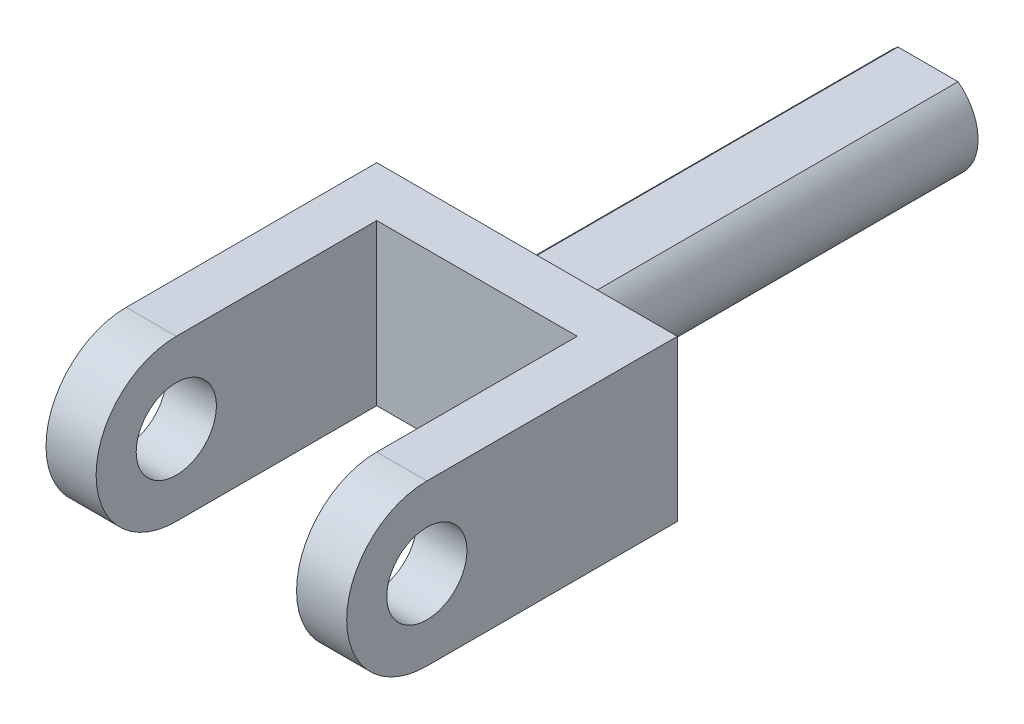
ISO-10303-21;
HEADER;
FILE_DESCRIPTION(('STEP AP214'),'2;1');
FILE_NAME('part.step','',(''),(''),'','','');
FILE_SCHEMA(('AUTOMOTIVE_DESIGN { 1 0 10303 214 1 1 1 1 }'));
ENDSEC;
DATA;
#1=APPLICATION_CONTEXT('core data for automotive mechanical design processes');
#2=APPLICATION_PROTOCOL_DEFINITION('international standard','automotive_design',2000,#1);
#3=PRODUCT_CONTEXT('',#1,'mechanical');
#4=PRODUCT('Part','Part','',(#3));
#5=PRODUCT_RELATED_PRODUCT_CATEGORY('part','',(#4));
#6=PRODUCT_DEFINITION_FORMATION('','',#4);
#7=PRODUCT_DEFINITION_CONTEXT('part definition',#1,'design');
#8=PRODUCT_DEFINITION('design','',#6,#7);
#9=PRODUCT_DEFINITION_SHAPE('','',#8);
#10=(LENGTH_UNIT() NAMED_UNIT(*) SI_UNIT(.MILLI.,.METRE.));
#11=(NAMED_UNIT(*) PLANE_ANGLE_UNIT() SI_UNIT($,.RADIAN.));
#12=(NAMED_UNIT(*) SI_UNIT($,.STERADIAN.) SOLID_ANGLE_UNIT());
#13=UNCERTAINTY_MEASURE_WITH_UNIT(LENGTH_MEASURE(1.E-05),#10,'distance_accuracy_value','');
#14=(GEOMETRIC_REPRESENTATION_CONTEXT(3) GLOBAL_UNCERTAINTY_ASSIGNED_CONTEXT((#13)) GLOBAL_UNIT_ASSIGNED_CONTEXT((#10,
#11,#12)) REPRESENTATION_CONTEXT('',''));
#15=CARTESIAN_POINT('',(0.,0.,0.));
#16=DIRECTION('',(0.,0.,1.));
#17=DIRECTION('',(1.,0.,0.));
#18=AXIS2_PLACEMENT_3D('',#15,#16,#17);
#19=CARTESIAN_POINT('',(15.,-8.,0.));
#20=DIRECTION('',(0.,0.,1.));
#21=DIRECTION('',(0.,-1.,0.));
#22=AXIS2_PLACEMENT_3D('',#19,#20,#21);
#23=PLANE('',#22);
#24=DIRECTION('',(0.,1.,0.));
#25=VECTOR('',#24,1.);
#26=CARTESIAN_POINT('',(-15.,-8.,0.));
#27=LINE('',#26,#25);
#28=CARTESIAN_POINT('',(-15.,-8.,0.));
#29=VERTEX_POINT('',#28);
#30=CARTESIAN_POINT('',(-15.,8.,0.));
#31=VERTEX_POINT('',#30);
#32=EDGE_CURVE('E199',#29,#31,#27,.T.);
#33=ORIENTED_EDGE('',*,*,#32,.T.);
#34=DIRECTION('',(-1.,0.,0.));
#35=VECTOR('',#34,1.);
#36=CARTESIAN_POINT('',(15.,8.,0.));
#37=LINE('',#36,#35);
#38=CARTESIAN_POINT('',(15.,8.,0.));
#39=VERTEX_POINT('',#38);
#40=EDGE_CURVE('E206',#39,#31,#37,.T.);
#41=ORIENTED_EDGE('',*,*,#40,.F.);
#42=DIRECTION('',(0.,1.,0.));
#43=VECTOR('',#42,1.);
#44=CARTESIAN_POINT('',(15.,-8.,0.));
#45=LINE('',#44,#43);
#46=CARTESIAN_POINT('',(15.,-8.,0.));
#47=VERTEX_POINT('',#46);
#48=EDGE_CURVE('E190',#47,#39,#45,.T.);
#49=ORIENTED_EDGE('',*,*,#48,.F.);
#50=DIRECTION('',(-1.,0.,0.));
#51=VECTOR('',#50,1.);
#52=CARTESIAN_POINT('',(15.,-8.,0.));
#53=LINE('',#52,#51);
#54=EDGE_CURVE('E209',#47,#29,#53,.T.);
#55=ORIENTED_EDGE('',*,*,#54,.T.);
#56=EDGE_LOOP('',(#33,#41,#49,#55));
#57=FACE_BOUND('',#56,.T.);
#58=CARTESIAN_POINT('',(0.,0.,0.));
#59=DIRECTION('',(0.,0.,-1.));
#60=DIRECTION('',(0.,1.,0.));
#61=AXIS2_PLACEMENT_3D('',#58,#59,#60);
#62=CIRCLE('',#61,5.);
#63=CARTESIAN_POINT('',(3.,4.,0.));
#64=VERTEX_POINT('',#63);
#65=CARTESIAN_POINT('',(3.,-4.,0.));
#66=VERTEX_POINT('',#65);
#67=EDGE_CURVE('E51',#64,#66,#62,.T.);
#68=ORIENTED_EDGE('',*,*,#67,.F.);
#69=DIRECTION('',(1.,0.,0.));
#70=VECTOR('',#69,1.);
#71=CARTESIAN_POINT('',(3.,4.,0.));
#72=LINE('',#71,#70);
#73=CARTESIAN_POINT('',(-3.,4.,0.));
#74=VERTEX_POINT('',#73);
#75=EDGE_CURVE('E55',#74,#64,#72,.T.);
#76=ORIENTED_EDGE('',*,*,#75,.F.);
#77=CARTESIAN_POINT('',(0.,0.,0.));
#78=DIRECTION('',(0.,0.,-1.));
#79=DIRECTION('',(0.,1.,0.));
#80=AXIS2_PLACEMENT_3D('',#77,#78,#79);
#81=CIRCLE('',#80,5.);
#82=CARTESIAN_POINT('',(-3.,-4.,0.));
#83=VERTEX_POINT('',#82);
#84=EDGE_CURVE('E399',#83,#74,#81,.T.);
#85=ORIENTED_EDGE('',*,*,#84,.F.);
#86=DIRECTION('',(-1.,0.,0.));
#87=VECTOR('',#86,1.);
#88=CARTESIAN_POINT('',(3.,-4.,0.));
#89=LINE('',#88,#87);
#90=EDGE_CURVE('E405',#66,#83,#89,.T.);
#91=ORIENTED_EDGE('',*,*,#90,.F.);
#92=EDGE_LOOP('',(#68,#76,#85,#91));
#93=FACE_BOUND('',#92,.T.);
#94=ADVANCED_FACE('F34',(#57,#93),#23,.F.);
#95=CARTESIAN_POINT('',(15.,0.,25.));
#96=DIRECTION('',(-1.,0.,0.));
#97=DIRECTION('',(0.,0.,1.));
#98=AXIS2_PLACEMENT_3D('',#95,#96,#97);
#99=CYLINDRICAL_SURFACE('',#98,8.);
#100=CARTESIAN_POINT('',(-10.,0.,25.));
#101=DIRECTION('',(-1.,0.,0.));
#102=DIRECTION('',(0.,0.,1.));
#103=AXIS2_PLACEMENT_3D('',#100,#101,#102);
#104=CIRCLE('',#103,8.);
#105=CARTESIAN_POINT('',(-10.,-8.,25.));
#106=VERTEX_POINT('',#105);
#107=CARTESIAN_POINT('',(-10.,8.,25.));
#108=VERTEX_POINT('',#107);
#109=EDGE_CURVE('E175',#106,#108,#104,.T.);
#110=ORIENTED_EDGE('',*,*,#109,.T.);
#111=DIRECTION('',(-1.,0.,0.));
#112=VECTOR('',#111,1.);
#113=CARTESIAN_POINT('',(15.,7.99999999999999,25.));
#114=LINE('',#113,#112);
#115=CARTESIAN_POINT('',(-15.,7.99999999999999,25.));
#116=VERTEX_POINT('',#115);
#117=EDGE_CURVE('E194',#108,#116,#114,.T.);
#118=ORIENTED_EDGE('',*,*,#117,.T.);
#119=CARTESIAN_POINT('',(-15.,0.,25.));
#120=DIRECTION('',(1.,0.,0.));
#121=DIRECTION('',(0.,0.,-1.));
#122=AXIS2_PLACEMENT_3D('',#119,#120,#121);
#123=CIRCLE('',#122,8.);
#124=CARTESIAN_POINT('',(-15.,-8.,25.));
#125=VERTEX_POINT('',#124);
#126=EDGE_CURVE('E181',#116,#125,#123,.T.);
#127=ORIENTED_EDGE('',*,*,#126,.T.);
#128=DIRECTION('',(-1.,0.,0.));
#129=VECTOR('',#128,1.);
#130=CARTESIAN_POINT('',(15.,-8.,25.));
#131=LINE('',#130,#129);
#132=EDGE_CURVE('E43',#106,#125,#131,.T.);
#133=ORIENTED_EDGE('',*,*,#132,.F.);
#134=EDGE_LOOP('',(#110,#118,#127,#133));
#135=FACE_BOUND('',#134,.T.);
#136=ADVANCED_FACE('F237',(#135),#99,.T.);
#137=CARTESIAN_POINT('',(15.,0.,25.));
#138=DIRECTION('',(-1.,0.,0.));
#139=DIRECTION('',(0.,0.,1.));
#140=AXIS2_PLACEMENT_3D('',#137,#138,#139);
#141=CYLINDRICAL_SURFACE('',#140,4.);
#142=CARTESIAN_POINT('',(-10.,0.,25.));
#143=DIRECTION('',(-1.,0.,0.));
#144=DIRECTION('',(0.,0.,1.));
#145=AXIS2_PLACEMENT_3D('',#142,#143,#144);
#146=CIRCLE('',#145,4.);
#147=CARTESIAN_POINT('',(-10.,0.,29.));
#148=VERTEX_POINT('',#147);
#149=EDGE_CURVE('E38',#148,#148,#146,.T.);
#150=ORIENTED_EDGE('',*,*,#149,.F.);
#151=EDGE_LOOP('',(#150));
#152=FACE_BOUND('',#151,.T.);
#153=CARTESIAN_POINT('',(-15.,0.,25.));
#154=DIRECTION('',(1.,0.,0.));
#155=DIRECTION('',(0.,0.,-1.));
#156=AXIS2_PLACEMENT_3D('',#153,#154,#155);
#157=CIRCLE('',#156,4.);
#158=CARTESIAN_POINT('',(-15.,0.,21.));
#159=VERTEX_POINT('',#158);
#160=EDGE_CURVE('E177',#159,#159,#157,.T.);
#161=ORIENTED_EDGE('',*,*,#160,.F.);
#162=EDGE_LOOP('',(#161));
#163=FACE_BOUND('',#162,.T.);
#164=ADVANCED_FACE('F223',(#152,#163),#141,.F.);
#165=CARTESIAN_POINT('',(15.,0.,25.));
#166=DIRECTION('',(1.,0.,0.));
#167=DIRECTION('',(0.,0.,-1.));
#168=AXIS2_PLACEMENT_3D('',#165,#166,#167);
#169=PLANE('',#168);
#170=CARTESIAN_POINT('',(15.,0.,25.));
#171=DIRECTION('',(1.,0.,0.));
#172=DIRECTION('',(0.,0.,-1.));
#173=AXIS2_PLACEMENT_3D('',#170,#171,#172);
#174=CIRCLE('',#173,8.);
#175=CARTESIAN_POINT('',(15.,7.99999999999999,25.));
#176=VERTEX_POINT('',#175);
#177=CARTESIAN_POINT('',(15.,-8.,25.));
#178=VERTEX_POINT('',#177);
#179=EDGE_CURVE('E184',#176,#178,#174,.T.);
#180=ORIENTED_EDGE('',*,*,#179,.T.);
#181=DIRECTION('',(0.,0.,-1.));
#182=VECTOR('',#181,1.);
#183=CARTESIAN_POINT('',(15.,-8.,25.));
#184=LINE('',#183,#182);
#185=EDGE_CURVE('E187',#178,#47,#184,.T.);
#186=ORIENTED_EDGE('',*,*,#185,.T.);
#187=ORIENTED_EDGE('',*,*,#48,.T.);
#188=DIRECTION('',(0.,0.,1.));
#189=VECTOR('',#188,1.);
#190=CARTESIAN_POINT('',(15.,7.99999999999999,25.));
#191=LINE('',#190,#189);
#192=EDGE_CURVE('E192',#39,#176,#191,.T.);
#193=ORIENTED_EDGE('',*,*,#192,.T.);
#194=EDGE_LOOP('',(#180,#186,#187,#193));
#195=FACE_BOUND('',#194,.T.);
#196=CARTESIAN_POINT('',(15.,0.,25.));
#197=DIRECTION('',(1.,0.,0.));
#198=DIRECTION('',(0.,0.,-1.));
#199=AXIS2_PLACEMENT_3D('',#196,#197,#198);
#200=CIRCLE('',#199,4.);
#201=CARTESIAN_POINT('',(15.,0.,21.));
#202=VERTEX_POINT('',#201);
#203=EDGE_CURVE('E178',#202,#202,#200,.T.);
#204=ORIENTED_EDGE('',*,*,#203,.F.);
#205=EDGE_LOOP('',(#204));
#206=FACE_BOUND('',#205,.T.);
#207=ADVANCED_FACE('F226',(#195,#206),#169,.T.);
#208=CARTESIAN_POINT('',(-15.,0.,25.));
#209=DIRECTION('',(1.,0.,0.));
#210=DIRECTION('',(0.,0.,-1.));
#211=AXIS2_PLACEMENT_3D('',#208,#209,#210);
#212=PLANE('',#211);
#213=ORIENTED_EDGE('',*,*,#126,.F.);
#214=DIRECTION('',(0.,0.,1.));
#215=VECTOR('',#214,1.);
#216=CARTESIAN_POINT('',(-15.,7.99999999999999,25.));
#217=LINE('',#216,#215);
#218=EDGE_CURVE('E188',#31,#116,#217,.T.);
#219=ORIENTED_EDGE('',*,*,#218,.F.);
#220=ORIENTED_EDGE('',*,*,#32,.F.);
#221=DIRECTION('',(0.,0.,-1.));
#222=VECTOR('',#221,1.);
#223=CARTESIAN_POINT('',(-15.,-8.,25.));
#224=LINE('',#223,#222);
#225=EDGE_CURVE('E197',#125,#29,#224,.T.);
#226=ORIENTED_EDGE('',*,*,#225,.F.);
#227=EDGE_LOOP('',(#213,#219,#220,#226));
#228=FACE_BOUND('',#227,.T.);
#229=ORIENTED_EDGE('',*,*,#160,.T.);
#230=EDGE_LOOP('',(#229));
#231=FACE_BOUND('',#230,.T.);
#232=ADVANCED_FACE('F228',(#228,#231),#212,.F.);
#233=CARTESIAN_POINT('',(10.,7.99999999999999,25.));
#234=VERTEX_POINT('',#233);
#235=EDGE_CURVE('E203',#176,#234,#114,.T.);
#236=ORIENTED_EDGE('',*,*,#235,.T.);
#237=CARTESIAN_POINT('',(10.,0.,25.));
#238=DIRECTION('',(1.,0.,0.));
#239=DIRECTION('',(0.,0.,-1.));
#240=AXIS2_PLACEMENT_3D('',#237,#238,#239);
#241=CIRCLE('',#240,8.);
#242=CARTESIAN_POINT('',(10.,-8.,25.));
#243=VERTEX_POINT('',#242);
#244=EDGE_CURVE('E173',#234,#243,#241,.T.);
#245=ORIENTED_EDGE('',*,*,#244,.T.);
#246=EDGE_CURVE('E11',#178,#243,#131,.T.);
#247=ORIENTED_EDGE('',*,*,#246,.F.);
#248=ORIENTED_EDGE('',*,*,#179,.F.);
#249=EDGE_LOOP('',(#236,#245,#247,#248));
#250=FACE_BOUND('',#249,.T.);
#251=ADVANCED_FACE('F36',(#250),#99,.T.);
#252=CARTESIAN_POINT('',(15.,-8.,25.));
#253=DIRECTION('',(0.,1.,0.));
#254=DIRECTION('',(0.,0.,1.));
#255=AXIS2_PLACEMENT_3D('',#252,#253,#254);
#256=PLANE('',#255);
#257=DIRECTION('',(-1.,0.,0.));
#258=VECTOR('',#257,1.);
#259=CARTESIAN_POINT('',(-10.,-8.,5.));
#260=LINE('',#259,#258);
#261=CARTESIAN_POINT('',(10.,-8.,5.));
#262=VERTEX_POINT('',#261);
#263=CARTESIAN_POINT('',(-10.,-8.,5.));
#264=VERTEX_POINT('',#263);
#265=EDGE_CURVE('E164',#262,#264,#260,.T.);
#266=ORIENTED_EDGE('',*,*,#265,.T.);
#267=DIRECTION('',(0.,0.,1.));
#268=VECTOR('',#267,1.);
#269=CARTESIAN_POINT('',(-10.,-8.,33.));
#270=LINE('',#269,#268);
#271=EDGE_CURVE('E158',#264,#106,#270,.T.);
#272=ORIENTED_EDGE('',*,*,#271,.T.);
#273=ORIENTED_EDGE('',*,*,#132,.T.);
#274=ORIENTED_EDGE('',*,*,#225,.T.);
#275=ORIENTED_EDGE('',*,*,#54,.F.);
#276=ORIENTED_EDGE('',*,*,#185,.F.);
#277=ORIENTED_EDGE('',*,*,#246,.T.);
#278=DIRECTION('',(0.,0.,-1.));
#279=VECTOR('',#278,1.);
#280=CARTESIAN_POINT('',(10.,-8.,33.));
#281=LINE('',#280,#279);
#282=EDGE_CURVE('E161',#243,#262,#281,.T.);
#283=ORIENTED_EDGE('',*,*,#282,.T.);
#284=EDGE_LOOP('',(#266,#272,#273,#274,#275,#276,#277,#283));
#285=FACE_BOUND('',#284,.T.);
#286=ADVANCED_FACE('F247',(#285),#256,.F.);
#287=CARTESIAN_POINT('',(15.,7.99999999999999,25.));
#288=DIRECTION('',(0.,-1.,0.));
#289=DIRECTION('',(0.,0.,-1.));
#290=AXIS2_PLACEMENT_3D('',#287,#288,#289);
#291=PLANE('',#290);
#292=ORIENTED_EDGE('',*,*,#117,.F.);
#293=DIRECTION('',(0.,0.,1.));
#294=VECTOR('',#293,1.);
#295=CARTESIAN_POINT('',(-10.,8.,33.));
#296=LINE('',#295,#294);
#297=CARTESIAN_POINT('',(-10.,8.,5.));
#298=VERTEX_POINT('',#297);
#299=EDGE_CURVE('E145',#298,#108,#296,.T.);
#300=ORIENTED_EDGE('',*,*,#299,.F.);
#301=DIRECTION('',(-1.,0.,0.));
#302=VECTOR('',#301,1.);
#303=CARTESIAN_POINT('',(-10.,8.,5.));
#304=LINE('',#303,#302);
#305=CARTESIAN_POINT('',(10.,8.,5.));
#306=VERTEX_POINT('',#305);
#307=EDGE_CURVE('E155',#306,#298,#304,.T.);
#308=ORIENTED_EDGE('',*,*,#307,.F.);
#309=DIRECTION('',(0.,0.,-1.));
#310=VECTOR('',#309,1.);
#311=CARTESIAN_POINT('',(10.,8.,33.));
#312=LINE('',#311,#310);
#313=EDGE_CURVE('E148',#234,#306,#312,.T.);
#314=ORIENTED_EDGE('',*,*,#313,.F.);
#315=ORIENTED_EDGE('',*,*,#235,.F.);
#316=ORIENTED_EDGE('',*,*,#192,.F.);
#317=ORIENTED_EDGE('',*,*,#40,.T.);
#318=ORIENTED_EDGE('',*,*,#218,.T.);
#319=EDGE_LOOP('',(#292,#300,#308,#314,#315,#316,#317,#318));
#320=FACE_BOUND('',#319,.T.);
#321=ADVANCED_FACE('F221',(#320),#291,.F.);
#322=CARTESIAN_POINT('',(10.,0.,25.));
#323=DIRECTION('',(1.,0.,0.));
#324=DIRECTION('',(0.,0.,-1.));
#325=AXIS2_PLACEMENT_3D('',#322,#323,#324);
#326=CIRCLE('',#325,4.);
#327=CARTESIAN_POINT('',(10.,0.,21.));
#328=VERTEX_POINT('',#327);
#329=EDGE_CURVE('E170',#328,#328,#326,.T.);
#330=ORIENTED_EDGE('',*,*,#329,.F.);
#331=EDGE_LOOP('',(#330));
#332=FACE_BOUND('',#331,.T.);
#333=ORIENTED_EDGE('',*,*,#203,.T.);
#334=EDGE_LOOP('',(#333));
#335=FACE_BOUND('',#334,.T.);
#336=ADVANCED_FACE('F217',(#332,#335),#141,.F.);
#337=CARTESIAN_POINT('',(-10.,-8.,33.));
#338=DIRECTION('',(-1.,0.,0.));
#339=DIRECTION('',(0.,0.,1.));
#340=AXIS2_PLACEMENT_3D('',#337,#338,#339);
#341=PLANE('',#340);
#342=ORIENTED_EDGE('',*,*,#149,.T.);
#343=EDGE_LOOP('',(#342));
#344=FACE_BOUND('',#343,.T.);
#345=ORIENTED_EDGE('',*,*,#109,.F.);
#346=ORIENTED_EDGE('',*,*,#271,.F.);
#347=DIRECTION('',(0.,1.,0.));
#348=VECTOR('',#347,1.);
#349=CARTESIAN_POINT('',(-10.,-8.,5.));
#350=LINE('',#349,#348);
#351=EDGE_CURVE('E168',#264,#298,#350,.T.);
#352=ORIENTED_EDGE('',*,*,#351,.T.);
#353=ORIENTED_EDGE('',*,*,#299,.T.);
#354=EDGE_LOOP('',(#345,#346,#352,#353));
#355=FACE_BOUND('',#354,.T.);
#356=ADVANCED_FACE('F220',(#344,#355),#341,.F.);
#357=CARTESIAN_POINT('',(10.,-8.,33.));
#358=DIRECTION('',(1.,0.,0.));
#359=DIRECTION('',(0.,0.,-1.));
#360=AXIS2_PLACEMENT_3D('',#357,#358,#359);
#361=PLANE('',#360);
#362=ORIENTED_EDGE('',*,*,#329,.T.);
#363=EDGE_LOOP('',(#362));
#364=FACE_BOUND('',#363,.T.);
#365=ORIENTED_EDGE('',*,*,#313,.T.);
#366=DIRECTION('',(0.,1.,0.));
#367=VECTOR('',#366,1.);
#368=CARTESIAN_POINT('',(10.,-8.,5.));
#369=LINE('',#368,#367);
#370=EDGE_CURVE('E167',#262,#306,#369,.T.);
#371=ORIENTED_EDGE('',*,*,#370,.F.);
#372=ORIENTED_EDGE('',*,*,#282,.F.);
#373=ORIENTED_EDGE('',*,*,#244,.F.);
#374=EDGE_LOOP('',(#365,#371,#372,#373));
#375=FACE_BOUND('',#374,.T.);
#376=ADVANCED_FACE('F214',(#364,#375),#361,.F.);
#377=CARTESIAN_POINT('',(-10.,-8.,5.));
#378=DIRECTION('',(0.,0.,-1.));
#379=DIRECTION('',(-1.,0.,0.));
#380=AXIS2_PLACEMENT_3D('',#377,#378,#379);
#381=PLANE('',#380);
#382=ORIENTED_EDGE('',*,*,#351,.F.);
#383=ORIENTED_EDGE('',*,*,#265,.F.);
#384=ORIENTED_EDGE('',*,*,#370,.T.);
#385=ORIENTED_EDGE('',*,*,#307,.T.);
#386=EDGE_LOOP('',(#382,#383,#384,#385));
#387=FACE_BOUND('',#386,.T.);
#388=ADVANCED_FACE('F261',(#387),#381,.F.);
#389=CARTESIAN_POINT('',(0.,0.,-40.));
#390=DIRECTION('',(0.,0.,1.));
#391=DIRECTION('',(0.,-1.,0.));
#392=AXIS2_PLACEMENT_3D('',#389,#390,#391);
#393=CYLINDRICAL_SURFACE('',#392,5.);
#394=ORIENTED_EDGE('',*,*,#67,.T.);
#395=DIRECTION('',(0.,0.,1.));
#396=VECTOR('',#395,1.);
#397=CARTESIAN_POINT('',(3.,-3.99999999999999,-40.));
#398=LINE('',#397,#396);
#399=CARTESIAN_POINT('',(3.,-3.99999999999999,-40.));
#400=VERTEX_POINT('',#399);
#401=EDGE_CURVE('E128',#400,#66,#398,.T.);
#402=ORIENTED_EDGE('',*,*,#401,.F.);
#403=CARTESIAN_POINT('',(0.,0.,-40.));
#404=DIRECTION('',(0.,0.,-1.));
#405=DIRECTION('',(0.,1.,0.));
#406=AXIS2_PLACEMENT_3D('',#403,#404,#405);
#407=CIRCLE('',#406,5.);
#408=CARTESIAN_POINT('',(3.,4.00000000000001,-40.));
#409=VERTEX_POINT('',#408);
#410=EDGE_CURVE('E134',#409,#400,#407,.T.);
#411=ORIENTED_EDGE('',*,*,#410,.F.);
#412=DIRECTION('',(0.,0.,1.));
#413=VECTOR('',#412,1.);
#414=CARTESIAN_POINT('',(3.,4.00000000000001,-40.));
#415=LINE('',#414,#413);
#416=EDGE_CURVE('E397',#409,#64,#415,.T.);
#417=ORIENTED_EDGE('',*,*,#416,.T.);
#418=EDGE_LOOP('',(#394,#402,#411,#417));
#419=FACE_BOUND('',#418,.T.);
#420=ADVANCED_FACE('F144',(#419),#393,.T.);
#421=CARTESIAN_POINT('',(3.,-3.99999999999999,-40.));
#422=DIRECTION('',(0.,1.,0.));
#423=DIRECTION('',(0.,0.,1.));
#424=AXIS2_PLACEMENT_3D('',#421,#422,#423);
#425=PLANE('',#424);
#426=ORIENTED_EDGE('',*,*,#90,.T.);
#427=DIRECTION('',(0.,0.,1.));
#428=VECTOR('',#427,1.);
#429=CARTESIAN_POINT('',(-3.,-3.99999999999999,-40.));
#430=LINE('',#429,#428);
#431=CARTESIAN_POINT('',(-3.,-3.99999999999999,-40.));
#432=VERTEX_POINT('',#431);
#433=EDGE_CURVE('E130',#432,#83,#430,.T.);
#434=ORIENTED_EDGE('',*,*,#433,.F.);
#435=DIRECTION('',(-1.,0.,0.));
#436=VECTOR('',#435,1.);
#437=CARTESIAN_POINT('',(3.,-3.99999999999999,-40.));
#438=LINE('',#437,#436);
#439=EDGE_CURVE('E123',#400,#432,#438,.T.);
#440=ORIENTED_EDGE('',*,*,#439,.F.);
#441=ORIENTED_EDGE('',*,*,#401,.T.);
#442=EDGE_LOOP('',(#426,#434,#440,#441));
#443=FACE_BOUND('',#442,.T.);
#444=ADVANCED_FACE('F126',(#443),#425,.F.);
#445=CARTESIAN_POINT('',(0.,0.,-40.));
#446=DIRECTION('',(0.,0.,1.));
#447=DIRECTION('',(0.,-1.,0.));
#448=AXIS2_PLACEMENT_3D('',#445,#446,#447);
#449=CYLINDRICAL_SURFACE('',#448,5.);
#450=ORIENTED_EDGE('',*,*,#84,.T.);
#451=DIRECTION('',(0.,0.,1.));
#452=VECTOR('',#451,1.);
#453=CARTESIAN_POINT('',(-3.,4.00000000000001,-40.));
#454=LINE('',#453,#452);
#455=CARTESIAN_POINT('',(-3.,4.00000000000001,-40.));
#456=VERTEX_POINT('',#455);
#457=EDGE_CURVE('E150',#456,#74,#454,.T.);
#458=ORIENTED_EDGE('',*,*,#457,.F.);
#459=CARTESIAN_POINT('',(0.,0.,-40.));
#460=DIRECTION('',(0.,0.,-1.));
#461=DIRECTION('',(0.,1.,0.));
#462=AXIS2_PLACEMENT_3D('',#459,#460,#461);
#463=CIRCLE('',#462,5.);
#464=EDGE_CURVE('E133',#432,#456,#463,.T.);
#465=ORIENTED_EDGE('',*,*,#464,.F.);
#466=ORIENTED_EDGE('',*,*,#433,.T.);
#467=EDGE_LOOP('',(#450,#458,#465,#466));
#468=FACE_BOUND('',#467,.T.);
#469=ADVANCED_FACE('F293',(#468),#449,.T.);
#470=CARTESIAN_POINT('',(3.,4.00000000000001,-40.));
#471=DIRECTION('',(0.,-1.,0.));
#472=DIRECTION('',(0.,0.,-1.));
#473=AXIS2_PLACEMENT_3D('',#470,#471,#472);
#474=PLANE('',#473);
#475=ORIENTED_EDGE('',*,*,#75,.T.);
#476=ORIENTED_EDGE('',*,*,#416,.F.);
#477=DIRECTION('',(1.,0.,0.));
#478=VECTOR('',#477,1.);
#479=CARTESIAN_POINT('',(3.,4.00000000000001,-40.));
#480=LINE('',#479,#478);
#481=EDGE_CURVE('E139',#456,#409,#480,.T.);
#482=ORIENTED_EDGE('',*,*,#481,.F.);
#483=ORIENTED_EDGE('',*,*,#457,.T.);
#484=EDGE_LOOP('',(#475,#476,#482,#483));
#485=FACE_BOUND('',#484,.T.);
#486=ADVANCED_FACE('F296',(#485),#474,.F.);
#487=CARTESIAN_POINT('',(0.,0.,-40.));
#488=DIRECTION('',(0.,0.,-1.));
#489=DIRECTION('',(0.,1.,0.));
#490=AXIS2_PLACEMENT_3D('',#487,#488,#489);
#491=PLANE('',#490);
#492=ORIENTED_EDGE('',*,*,#410,.T.);
#493=ORIENTED_EDGE('',*,*,#439,.T.);
#494=ORIENTED_EDGE('',*,*,#464,.T.);
#495=ORIENTED_EDGE('',*,*,#481,.T.);
#496=EDGE_LOOP('',(#492,#493,#494,#495));
#497=FACE_BOUND('',#496,.T.);
#498=ADVANCED_FACE('F137',(#497),#491,.T.);
#499=CLOSED_SHELL('',(#94,#136,#164,#207,#232,#251,#286,#321,#336,#356,#376,#388,#420,#444,#469,
#486,#498));
#500=MANIFOLD_SOLID_BREP('B2',#499);
#501=ADVANCED_BREP_SHAPE_REPRESENTATION('',(#18,#500),#14);
#502=SHAPE_DEFINITION_REPRESENTATION(#9,#501);
ENDSEC;
END-ISO-10303-21;
